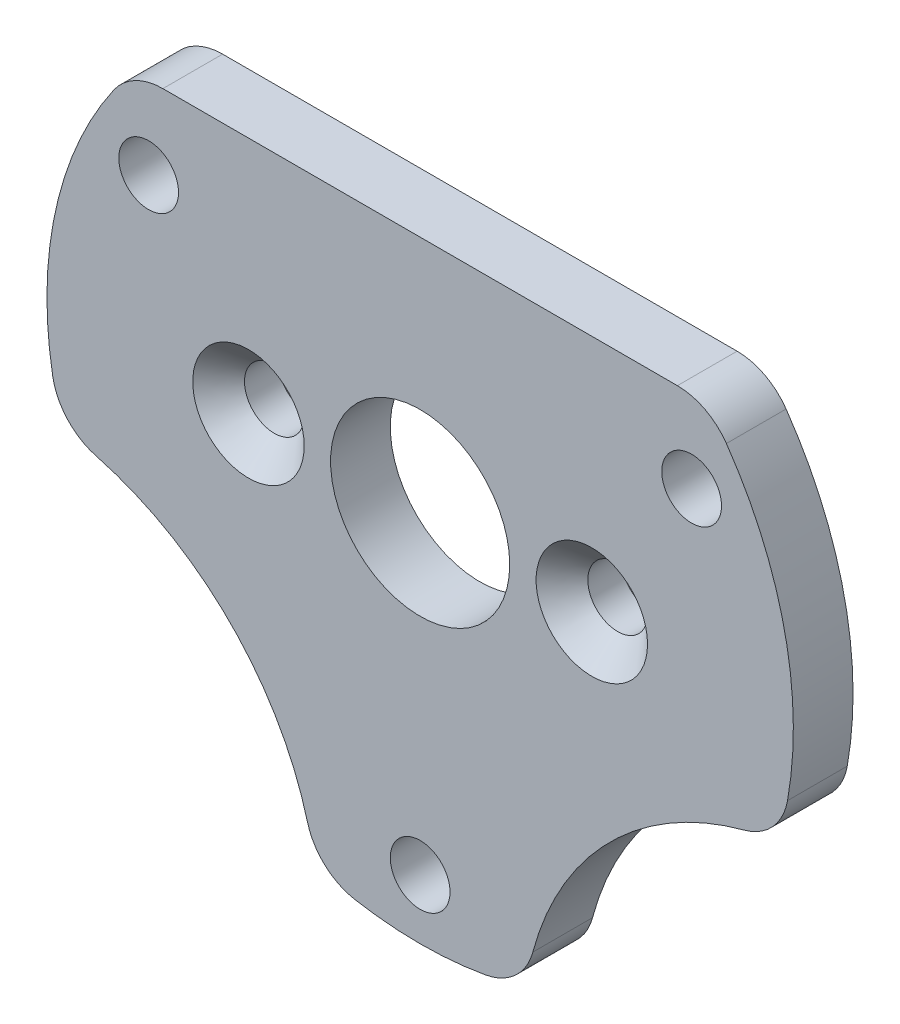
ISO-10303-21;
HEADER;
FILE_DESCRIPTION(('STEP AP214'),'2;1');
FILE_NAME('part.step','',(''),(''),'','','');
FILE_SCHEMA(('AUTOMOTIVE_DESIGN { 1 0 10303 214 1 1 1 1 }'));
ENDSEC;
DATA;
#1=APPLICATION_CONTEXT('core data for automotive mechanical design processes');
#2=APPLICATION_PROTOCOL_DEFINITION('international standard','automotive_design',2000,#1);
#3=PRODUCT_CONTEXT('',#1,'mechanical');
#4=PRODUCT('Part','Part','',(#3));
#5=PRODUCT_RELATED_PRODUCT_CATEGORY('part','',(#4));
#6=PRODUCT_DEFINITION_FORMATION('','',#4);
#7=PRODUCT_DEFINITION_CONTEXT('part definition',#1,'design');
#8=PRODUCT_DEFINITION('design','',#6,#7);
#9=PRODUCT_DEFINITION_SHAPE('','',#8);
#10=(LENGTH_UNIT() NAMED_UNIT(*) SI_UNIT(.MILLI.,.METRE.));
#11=(NAMED_UNIT(*) PLANE_ANGLE_UNIT() SI_UNIT($,.RADIAN.));
#12=(NAMED_UNIT(*) SI_UNIT($,.STERADIAN.) SOLID_ANGLE_UNIT());
#13=UNCERTAINTY_MEASURE_WITH_UNIT(LENGTH_MEASURE(1.E-05),#10,'distance_accuracy_value','');
#14=(GEOMETRIC_REPRESENTATION_CONTEXT(3) GLOBAL_UNCERTAINTY_ASSIGNED_CONTEXT((#13)) GLOBAL_UNIT_ASSIGNED_CONTEXT((#10,
#11,#12)) REPRESENTATION_CONTEXT('',''));
#15=CARTESIAN_POINT('',(0.,0.,0.));
#16=DIRECTION('',(0.,0.,1.));
#17=DIRECTION('',(1.,0.,0.));
#18=AXIS2_PLACEMENT_3D('',#15,#16,#17);
#19=CARTESIAN_POINT('',(0.,0.,2.));
#20=DIRECTION('',(0.,0.,-1.));
#21=DIRECTION('',(-1.,0.,0.));
#22=AXIS2_PLACEMENT_3D('',#19,#20,#21);
#23=CYLINDRICAL_SURFACE('',#22,12.5);
#24=CARTESIAN_POINT('',(0.,0.,0.));
#25=DIRECTION('',(0.,0.,1.));
#26=DIRECTION('',(1.,0.,0.));
#27=AXIS2_PLACEMENT_3D('',#24,#25,#26);
#28=CIRCLE('',#27,12.5);
#29=CARTESIAN_POINT('',(-2.19259090002556,-12.3061994598302,0.));
#30=VERTEX_POINT('',#29);
#31=CARTESIAN_POINT('',(2.19259090002556,-12.3061994598302,0.));
#32=VERTEX_POINT('',#31);
#33=EDGE_CURVE('E259',#30,#32,#28,.T.);
#34=ORIENTED_EDGE('',*,*,#33,.T.);
#35=DIRECTION('',(0.,0.,-1.));
#36=VECTOR('',#35,1.);
#37=CARTESIAN_POINT('',(2.19259090002556,-12.3061994598302,2.));
#38=LINE('',#37,#36);
#39=CARTESIAN_POINT('',(2.19259090002556,-12.3061994598302,2.));
#40=VERTEX_POINT('',#39);
#41=EDGE_CURVE('E183',#32,#40,#38,.F.);
#42=ORIENTED_EDGE('',*,*,#41,.T.);
#43=CARTESIAN_POINT('',(0.,0.,2.));
#44=DIRECTION('',(0.,0.,1.));
#45=DIRECTION('',(1.,0.,0.));
#46=AXIS2_PLACEMENT_3D('',#43,#44,#45);
#47=CIRCLE('',#46,12.5);
#48=CARTESIAN_POINT('',(-2.19259090002556,-12.3061994598302,2.));
#49=VERTEX_POINT('',#48);
#50=EDGE_CURVE('E147',#49,#40,#47,.T.);
#51=ORIENTED_EDGE('',*,*,#50,.F.);
#52=DIRECTION('',(0.,0.,-1.));
#53=VECTOR('',#52,1.);
#54=CARTESIAN_POINT('',(-2.19259090002556,-12.3061994598302,2.));
#55=LINE('',#54,#53);
#56=EDGE_CURVE('E137',#49,#30,#55,.T.);
#57=ORIENTED_EDGE('',*,*,#56,.T.);
#58=EDGE_LOOP('',(#34,#42,#51,#57));
#59=FACE_BOUND('',#58,.T.);
#60=ADVANCED_FACE('F34',(#59),#23,.T.);
#61=CARTESIAN_POINT('',(-10.2581475831036,7.14285714285714,0.));
#62=VERTEX_POINT('',#61);
#63=CARTESIAN_POINT('',(-12.3061994598302,-2.19259090002552,0.));
#64=VERTEX_POINT('',#63);
#65=EDGE_CURVE('E257',#62,#64,#28,.T.);
#66=ORIENTED_EDGE('',*,*,#65,.T.);
#67=DIRECTION('',(0.,0.,-1.));
#68=VECTOR('',#67,1.);
#69=CARTESIAN_POINT('',(-12.3061994598302,-2.19259090002552,2.));
#70=LINE('',#69,#68);
#71=CARTESIAN_POINT('',(-12.3061994598302,-2.19259090002552,2.));
#72=VERTEX_POINT('',#71);
#73=EDGE_CURVE('E192',#64,#72,#70,.F.);
#74=ORIENTED_EDGE('',*,*,#73,.T.);
#75=CARTESIAN_POINT('',(-10.2581475831036,7.14285714285714,2.));
#76=VERTEX_POINT('',#75);
#77=EDGE_CURVE('E150',#76,#72,#47,.T.);
#78=ORIENTED_EDGE('',*,*,#77,.F.);
#79=DIRECTION('',(0.,0.,-1.));
#80=VECTOR('',#79,1.);
#81=CARTESIAN_POINT('',(-10.2581475831036,7.14285714285714,2.));
#82=LINE('',#81,#80);
#83=EDGE_CURVE('E189',#76,#62,#82,.T.);
#84=ORIENTED_EDGE('',*,*,#83,.T.);
#85=EDGE_LOOP('',(#66,#74,#78,#84));
#86=FACE_BOUND('',#85,.T.);
#87=ADVANCED_FACE('F274',(#86),#23,.T.);
#88=CARTESIAN_POINT('',(0.,0.,2.));
#89=DIRECTION('',(0.,0.,1.));
#90=DIRECTION('',(1.,0.,0.));
#91=AXIS2_PLACEMENT_3D('',#88,#89,#90);
#92=PLANE('',#91);
#93=CARTESIAN_POINT('',(5.75,0.,2.));
#94=DIRECTION('',(0.,0.,1.));
#95=DIRECTION('',(1.,0.,0.));
#96=AXIS2_PLACEMENT_3D('',#93,#94,#95);
#97=CIRCLE('',#96,1.86600000000001);
#98=CARTESIAN_POINT('',(7.61600000000001,0.,2.));
#99=VERTEX_POINT('',#98);
#100=EDGE_CURVE('E42',#99,#99,#97,.F.);
#101=ORIENTED_EDGE('',*,*,#100,.T.);
#102=EDGE_LOOP('',(#101));
#103=FACE_BOUND('',#102,.T.);
#104=CARTESIAN_POINT('',(-5.75,0.,2.));
#105=DIRECTION('',(0.,0.,1.));
#106=DIRECTION('',(1.,0.,0.));
#107=AXIS2_PLACEMENT_3D('',#104,#105,#106);
#108=CIRCLE('',#107,1.86600000000001);
#109=CARTESIAN_POINT('',(-3.88399999999999,0.,2.));
#110=VERTEX_POINT('',#109);
#111=EDGE_CURVE('E203',#110,#110,#108,.F.);
#112=ORIENTED_EDGE('',*,*,#111,.T.);
#113=EDGE_LOOP('',(#112));
#114=FACE_BOUND('',#113,.T.);
#115=CARTESIAN_POINT('',(13.4350288425444,-13.4350288425444,2.));
#116=DIRECTION('',(0.,0.,1.));
#117=DIRECTION('',(1.,0.,0.));
#118=AXIS2_PLACEMENT_3D('',#115,#116,#117);
#119=CIRCLE('',#118,10.);
#120=CARTESIAN_POINT('',(10.8535110956386,-3.77398510377526,2.));
#121=VERTEX_POINT('',#120);
#122=CARTESIAN_POINT('',(3.7739851037753,-10.8535110956385,2.));
#123=VERTEX_POINT('',#122);
#124=EDGE_CURVE('E133',#121,#123,#119,.T.);
#125=ORIENTED_EDGE('',*,*,#124,.F.);
#126=CARTESIAN_POINT('',(10.3372075462574,-1.84177635602143,2.));
#127=DIRECTION('',(0.,0.,1.));
#128=DIRECTION('',(1.,0.,0.));
#129=AXIS2_PLACEMENT_3D('',#126,#127,#128);
#130=CIRCLE('',#129,2.);
#131=CARTESIAN_POINT('',(12.3061994598302,-2.19259090002551,2.));
#132=VERTEX_POINT('',#131);
#133=EDGE_CURVE('E126',#121,#132,#130,.T.);
#134=ORIENTED_EDGE('',*,*,#133,.T.);
#135=CARTESIAN_POINT('',(10.2581475831036,7.14285714285714,2.));
#136=VERTEX_POINT('',#135);
#137=EDGE_CURVE('E130',#132,#136,#47,.T.);
#138=ORIENTED_EDGE('',*,*,#137,.T.);
#139=CARTESIAN_POINT('',(8.61684396980704,6.,2.));
#140=DIRECTION('',(0.,0.,1.));
#141=DIRECTION('',(1.,0.,0.));
#142=AXIS2_PLACEMENT_3D('',#139,#140,#141);
#143=CIRCLE('',#142,2.);
#144=CARTESIAN_POINT('',(8.61684396980704,8.,2.));
#145=VERTEX_POINT('',#144);
#146=EDGE_CURVE('E175',#136,#145,#143,.T.);
#147=ORIENTED_EDGE('',*,*,#146,.T.);
#148=DIRECTION('',(-1.,0.,0.));
#149=VECTOR('',#148,1.);
#150=CARTESIAN_POINT('',(-9.60468635614927,8.,2.));
#151=LINE('',#150,#149);
#152=CARTESIAN_POINT('',(-8.61684396980704,8.,2.));
#153=VERTEX_POINT('',#152);
#154=EDGE_CURVE('E157',#145,#153,#151,.T.);
#155=ORIENTED_EDGE('',*,*,#154,.T.);
#156=CARTESIAN_POINT('',(-8.61684396980704,6.,2.));
#157=DIRECTION('',(0.,0.,1.));
#158=DIRECTION('',(1.,0.,0.));
#159=AXIS2_PLACEMENT_3D('',#156,#157,#158);
#160=CIRCLE('',#159,2.);
#161=EDGE_CURVE('E173',#153,#76,#160,.T.);
#162=ORIENTED_EDGE('',*,*,#161,.T.);
#163=ORIENTED_EDGE('',*,*,#77,.T.);
#164=CARTESIAN_POINT('',(-10.3372075462574,-1.84177635602144,2.));
#165=DIRECTION('',(0.,0.,1.));
#166=DIRECTION('',(1.,0.,0.));
#167=AXIS2_PLACEMENT_3D('',#164,#165,#166);
#168=CIRCLE('',#167,2.);
#169=CARTESIAN_POINT('',(-10.8535110956385,-3.77398510377526,2.));
#170=VERTEX_POINT('',#169);
#171=EDGE_CURVE('E177',#72,#170,#168,.T.);
#172=ORIENTED_EDGE('',*,*,#171,.T.);
#173=CARTESIAN_POINT('',(-13.4350288425444,-13.4350288425444,2.));
#174=DIRECTION('',(0.,0.,1.));
#175=DIRECTION('',(-1.,0.,0.));
#176=AXIS2_PLACEMENT_3D('',#173,#174,#175);
#177=CIRCLE('',#176,10.);
#178=CARTESIAN_POINT('',(-3.7739851037753,-10.8535110956385,2.));
#179=VERTEX_POINT('',#178);
#180=EDGE_CURVE('E282',#179,#170,#177,.T.);
#181=ORIENTED_EDGE('',*,*,#180,.F.);
#182=CARTESIAN_POINT('',(-1.84177635602147,-10.3372075462574,2.));
#183=DIRECTION('',(0.,0.,1.));
#184=DIRECTION('',(1.,0.,0.));
#185=AXIS2_PLACEMENT_3D('',#182,#183,#184);
#186=CIRCLE('',#185,2.);
#187=EDGE_CURVE('E57',#179,#49,#186,.T.);
#188=ORIENTED_EDGE('',*,*,#187,.T.);
#189=ORIENTED_EDGE('',*,*,#50,.T.);
#190=CARTESIAN_POINT('',(1.84177635602147,-10.3372075462574,2.));
#191=DIRECTION('',(0.,0.,1.));
#192=DIRECTION('',(1.,0.,0.));
#193=AXIS2_PLACEMENT_3D('',#190,#191,#192);
#194=CIRCLE('',#193,2.);
#195=EDGE_CURVE('E49',#40,#123,#194,.T.);
#196=ORIENTED_EDGE('',*,*,#195,.T.);
#197=EDGE_LOOP('',(#125,#134,#138,#147,#155,#162,#163,#172,#181,#188,#189,#196));
#198=FACE_BOUND('',#197,.T.);
#199=CARTESIAN_POINT('',(9.0932667397366,5.25,2.));
#200=DIRECTION('',(0.,0.,1.));
#201=DIRECTION('',(1.,0.,0.));
#202=AXIS2_PLACEMENT_3D('',#199,#200,#201);
#203=CIRCLE('',#202,1.);
#204=CARTESIAN_POINT('',(10.0932667397366,5.25,2.));
#205=VERTEX_POINT('',#204);
#206=EDGE_CURVE('E237',#205,#205,#203,.T.);
#207=ORIENTED_EDGE('',*,*,#206,.F.);
#208=EDGE_LOOP('',(#207));
#209=FACE_BOUND('',#208,.T.);
#210=CARTESIAN_POINT('',(0.,-10.5,2.));
#211=DIRECTION('',(0.,0.,1.));
#212=DIRECTION('',(1.,0.,0.));
#213=AXIS2_PLACEMENT_3D('',#210,#211,#212);
#214=CIRCLE('',#213,1.);
#215=CARTESIAN_POINT('',(0.999999999999999,-10.5,2.));
#216=VERTEX_POINT('',#215);
#217=EDGE_CURVE('E249',#216,#216,#214,.T.);
#218=ORIENTED_EDGE('',*,*,#217,.F.);
#219=EDGE_LOOP('',(#218));
#220=FACE_BOUND('',#219,.T.);
#221=CARTESIAN_POINT('',(-9.09326673973661,5.25,2.));
#222=DIRECTION('',(0.,0.,1.));
#223=DIRECTION('',(1.,0.,0.));
#224=AXIS2_PLACEMENT_3D('',#221,#222,#223);
#225=CIRCLE('',#224,1.);
#226=CARTESIAN_POINT('',(-8.09326673973661,5.25,2.));
#227=VERTEX_POINT('',#226);
#228=EDGE_CURVE('E243',#227,#227,#225,.T.);
#229=ORIENTED_EDGE('',*,*,#228,.F.);
#230=EDGE_LOOP('',(#229));
#231=FACE_BOUND('',#230,.T.);
#232=CARTESIAN_POINT('',(0.,0.,2.));
#233=DIRECTION('',(0.,0.,1.));
#234=DIRECTION('',(1.,0.,0.));
#235=AXIS2_PLACEMENT_3D('',#232,#233,#234);
#236=CIRCLE('',#235,3.);
#237=CARTESIAN_POINT('',(3.,0.,2.));
#238=VERTEX_POINT('',#237);
#239=EDGE_CURVE('E227',#238,#238,#236,.T.);
#240=ORIENTED_EDGE('',*,*,#239,.F.);
#241=EDGE_LOOP('',(#240));
#242=FACE_BOUND('',#241,.T.);
#243=ADVANCED_FACE('F128',(#103,#114,#198,#209,#220,#231,#242),#92,.T.);
#244=CARTESIAN_POINT('',(0.,0.,0.));
#245=DIRECTION('',(0.,0.,1.));
#246=DIRECTION('',(1.,0.,0.));
#247=AXIS2_PLACEMENT_3D('',#244,#245,#246);
#248=PLANE('',#247);
#249=CARTESIAN_POINT('',(12.3061994598302,-2.19259090002551,0.));
#250=VERTEX_POINT('',#249);
#251=CARTESIAN_POINT('',(10.2581475831036,7.14285714285714,0.));
#252=VERTEX_POINT('',#251);
#253=EDGE_CURVE('E252',#250,#252,#28,.T.);
#254=ORIENTED_EDGE('',*,*,#253,.F.);
#255=CARTESIAN_POINT('',(10.3372075462574,-1.84177635602143,0.));
#256=DIRECTION('',(0.,0.,1.));
#257=DIRECTION('',(1.,0.,0.));
#258=AXIS2_PLACEMENT_3D('',#255,#256,#257);
#259=CIRCLE('',#258,2.);
#260=CARTESIAN_POINT('',(10.8535110956386,-3.77398510377526,0.));
#261=VERTEX_POINT('',#260);
#262=EDGE_CURVE('E152',#250,#261,#259,.F.);
#263=ORIENTED_EDGE('',*,*,#262,.T.);
#264=CARTESIAN_POINT('',(13.4350288425444,-13.4350288425444,0.));
#265=DIRECTION('',(0.,0.,1.));
#266=DIRECTION('',(1.,0.,0.));
#267=AXIS2_PLACEMENT_3D('',#264,#265,#266);
#268=CIRCLE('',#267,10.);
#269=CARTESIAN_POINT('',(3.7739851037753,-10.8535110956385,0.));
#270=VERTEX_POINT('',#269);
#271=EDGE_CURVE('E289',#261,#270,#268,.T.);
#272=ORIENTED_EDGE('',*,*,#271,.T.);
#273=CARTESIAN_POINT('',(1.84177635602147,-10.3372075462574,0.));
#274=DIRECTION('',(0.,0.,1.));
#275=DIRECTION('',(1.,0.,0.));
#276=AXIS2_PLACEMENT_3D('',#273,#274,#275);
#277=CIRCLE('',#276,2.);
#278=EDGE_CURVE('E166',#270,#32,#277,.F.);
#279=ORIENTED_EDGE('',*,*,#278,.T.);
#280=ORIENTED_EDGE('',*,*,#33,.F.);
#281=CARTESIAN_POINT('',(-1.84177635602147,-10.3372075462574,0.));
#282=DIRECTION('',(0.,0.,1.));
#283=DIRECTION('',(1.,0.,0.));
#284=AXIS2_PLACEMENT_3D('',#281,#282,#283);
#285=CIRCLE('',#284,2.);
#286=CARTESIAN_POINT('',(-3.7739851037753,-10.8535110956385,0.));
#287=VERTEX_POINT('',#286);
#288=EDGE_CURVE('E164',#30,#287,#285,.F.);
#289=ORIENTED_EDGE('',*,*,#288,.T.);
#290=CARTESIAN_POINT('',(-13.4350288425444,-13.4350288425444,0.));
#291=DIRECTION('',(0.,0.,1.));
#292=DIRECTION('',(1.,0.,0.));
#293=AXIS2_PLACEMENT_3D('',#290,#291,#292);
#294=CIRCLE('',#293,10.);
#295=CARTESIAN_POINT('',(-10.8535110956385,-3.77398510377526,0.));
#296=VERTEX_POINT('',#295);
#297=EDGE_CURVE('E288',#287,#296,#294,.T.);
#298=ORIENTED_EDGE('',*,*,#297,.T.);
#299=CARTESIAN_POINT('',(-10.3372075462574,-1.84177635602144,0.));
#300=DIRECTION('',(0.,0.,1.));
#301=DIRECTION('',(1.,0.,0.));
#302=AXIS2_PLACEMENT_3D('',#299,#300,#301);
#303=CIRCLE('',#302,2.);
#304=EDGE_CURVE('E162',#296,#64,#303,.F.);
#305=ORIENTED_EDGE('',*,*,#304,.T.);
#306=ORIENTED_EDGE('',*,*,#65,.F.);
#307=CARTESIAN_POINT('',(-8.61684396980704,6.,0.));
#308=DIRECTION('',(0.,0.,1.));
#309=DIRECTION('',(1.,0.,0.));
#310=AXIS2_PLACEMENT_3D('',#307,#308,#309);
#311=CIRCLE('',#310,2.);
#312=CARTESIAN_POINT('',(-8.61684396980704,8.,0.));
#313=VERTEX_POINT('',#312);
#314=EDGE_CURVE('E153',#62,#313,#311,.F.);
#315=ORIENTED_EDGE('',*,*,#314,.T.);
#316=DIRECTION('',(-1.,0.,0.));
#317=VECTOR('',#316,1.);
#318=CARTESIAN_POINT('',(-9.60468635614927,8.,0.));
#319=LINE('',#318,#317);
#320=CARTESIAN_POINT('',(8.61684396980704,8.,0.));
#321=VERTEX_POINT('',#320);
#322=EDGE_CURVE('E148',#321,#313,#319,.T.);
#323=ORIENTED_EDGE('',*,*,#322,.F.);
#324=CARTESIAN_POINT('',(8.61684396980704,6.,0.));
#325=DIRECTION('',(0.,0.,1.));
#326=DIRECTION('',(1.,0.,0.));
#327=AXIS2_PLACEMENT_3D('',#324,#325,#326);
#328=CIRCLE('',#327,2.);
#329=EDGE_CURVE('E155',#321,#252,#328,.F.);
#330=ORIENTED_EDGE('',*,*,#329,.T.);
#331=EDGE_LOOP('',(#254,#263,#272,#279,#280,#289,#298,#305,#306,#315,#323,#330));
#332=FACE_BOUND('',#331,.T.);
#333=CARTESIAN_POINT('',(0.,-10.5,0.));
#334=DIRECTION('',(0.,0.,1.));
#335=DIRECTION('',(1.,0.,0.));
#336=AXIS2_PLACEMENT_3D('',#333,#334,#335);
#337=CIRCLE('',#336,1.);
#338=CARTESIAN_POINT('',(0.999999999999999,-10.5,0.));
#339=VERTEX_POINT('',#338);
#340=EDGE_CURVE('E246',#339,#339,#337,.T.);
#341=ORIENTED_EDGE('',*,*,#340,.T.);
#342=EDGE_LOOP('',(#341));
#343=FACE_BOUND('',#342,.T.);
#344=CARTESIAN_POINT('',(-9.09326673973661,5.25,0.));
#345=DIRECTION('',(0.,0.,1.));
#346=DIRECTION('',(1.,0.,0.));
#347=AXIS2_PLACEMENT_3D('',#344,#345,#346);
#348=CIRCLE('',#347,1.);
#349=CARTESIAN_POINT('',(-8.09326673973661,5.25,0.));
#350=VERTEX_POINT('',#349);
#351=EDGE_CURVE('E240',#350,#350,#348,.T.);
#352=ORIENTED_EDGE('',*,*,#351,.T.);
#353=EDGE_LOOP('',(#352));
#354=FACE_BOUND('',#353,.T.);
#355=CARTESIAN_POINT('',(9.0932667397366,5.25,0.));
#356=DIRECTION('',(0.,0.,1.));
#357=DIRECTION('',(1.,0.,0.));
#358=AXIS2_PLACEMENT_3D('',#355,#356,#357);
#359=CIRCLE('',#358,1.);
#360=CARTESIAN_POINT('',(10.0932667397366,5.25,0.));
#361=VERTEX_POINT('',#360);
#362=EDGE_CURVE('E230',#361,#361,#359,.T.);
#363=ORIENTED_EDGE('',*,*,#362,.T.);
#364=EDGE_LOOP('',(#363));
#365=FACE_BOUND('',#364,.T.);
#366=CARTESIAN_POINT('',(-5.75,0.,0.));
#367=DIRECTION('',(0.,0.,1.));
#368=DIRECTION('',(1.,0.,0.));
#369=AXIS2_PLACEMENT_3D('',#366,#367,#368);
#370=CIRCLE('',#369,1.);
#371=CARTESIAN_POINT('',(-4.75,0.,0.));
#372=VERTEX_POINT('',#371);
#373=EDGE_CURVE('E226',#372,#372,#370,.T.);
#374=ORIENTED_EDGE('',*,*,#373,.T.);
#375=EDGE_LOOP('',(#374));
#376=FACE_BOUND('',#375,.T.);
#377=CARTESIAN_POINT('',(5.75,0.,0.));
#378=DIRECTION('',(0.,0.,1.));
#379=DIRECTION('',(-1.,0.,0.));
#380=AXIS2_PLACEMENT_3D('',#377,#378,#379);
#381=CIRCLE('',#380,1.);
#382=CARTESIAN_POINT('',(4.75,0.,0.));
#383=VERTEX_POINT('',#382);
#384=EDGE_CURVE('E224',#383,#383,#381,.T.);
#385=ORIENTED_EDGE('',*,*,#384,.T.);
#386=EDGE_LOOP('',(#385));
#387=FACE_BOUND('',#386,.T.);
#388=CARTESIAN_POINT('',(0.,0.,0.));
#389=DIRECTION('',(0.,0.,1.));
#390=DIRECTION('',(1.,0.,0.));
#391=AXIS2_PLACEMENT_3D('',#388,#389,#390);
#392=CIRCLE('',#391,3.);
#393=CARTESIAN_POINT('',(3.,0.,0.));
#394=VERTEX_POINT('',#393);
#395=EDGE_CURVE('E233',#394,#394,#392,.T.);
#396=ORIENTED_EDGE('',*,*,#395,.T.);
#397=EDGE_LOOP('',(#396));
#398=FACE_BOUND('',#397,.T.);
#399=ADVANCED_FACE('F302',(#332,#343,#354,#365,#376,#387,#398),#248,.F.);
#400=ORIENTED_EDGE('',*,*,#137,.F.);
#401=DIRECTION('',(0.,0.,-1.));
#402=VECTOR('',#401,1.);
#403=CARTESIAN_POINT('',(12.3061994598302,-2.19259090002551,2.));
#404=LINE('',#403,#402);
#405=EDGE_CURVE('E143',#132,#250,#404,.T.);
#406=ORIENTED_EDGE('',*,*,#405,.T.);
#407=ORIENTED_EDGE('',*,*,#253,.T.);
#408=DIRECTION('',(0.,0.,-1.));
#409=VECTOR('',#408,1.);
#410=CARTESIAN_POINT('',(10.2581475831036,7.14285714285714,2.));
#411=LINE('',#410,#409);
#412=EDGE_CURVE('E146',#252,#136,#411,.F.);
#413=ORIENTED_EDGE('',*,*,#412,.T.);
#414=EDGE_LOOP('',(#400,#406,#407,#413));
#415=FACE_BOUND('',#414,.T.);
#416=ADVANCED_FACE('F141',(#415),#23,.T.);
#417=CARTESIAN_POINT('',(-9.60468635614927,8.,2.));
#418=DIRECTION('',(0.,-1.,0.));
#419=DIRECTION('',(0.,0.,-1.));
#420=AXIS2_PLACEMENT_3D('',#417,#418,#419);
#421=PLANE('',#420);
#422=ORIENTED_EDGE('',*,*,#154,.F.);
#423=DIRECTION('',(0.,0.,-1.));
#424=VECTOR('',#423,1.);
#425=CARTESIAN_POINT('',(8.61684396980704,8.,2.));
#426=LINE('',#425,#424);
#427=EDGE_CURVE('E197',#145,#321,#426,.T.);
#428=ORIENTED_EDGE('',*,*,#427,.T.);
#429=ORIENTED_EDGE('',*,*,#322,.T.);
#430=DIRECTION('',(0.,0.,-1.));
#431=VECTOR('',#430,1.);
#432=CARTESIAN_POINT('',(-8.61684396980704,8.,2.));
#433=LINE('',#432,#431);
#434=EDGE_CURVE('E195',#313,#153,#433,.F.);
#435=ORIENTED_EDGE('',*,*,#434,.T.);
#436=EDGE_LOOP('',(#422,#428,#429,#435));
#437=FACE_BOUND('',#436,.T.);
#438=ADVANCED_FACE('F265',(#437),#421,.F.);
#439=CARTESIAN_POINT('',(0.,-10.5,2.));
#440=DIRECTION('',(0.,0.,-1.));
#441=DIRECTION('',(-1.,0.,0.));
#442=AXIS2_PLACEMENT_3D('',#439,#440,#441);
#443=CYLINDRICAL_SURFACE('',#442,1.);
#444=ORIENTED_EDGE('',*,*,#217,.T.);
#445=EDGE_LOOP('',(#444));
#446=FACE_BOUND('',#445,.T.);
#447=ORIENTED_EDGE('',*,*,#340,.F.);
#448=EDGE_LOOP('',(#447));
#449=FACE_BOUND('',#448,.T.);
#450=ADVANCED_FACE('F329',(#446,#449),#443,.F.);
#451=CARTESIAN_POINT('',(-9.09326673973661,5.25,2.));
#452=DIRECTION('',(0.,0.,-1.));
#453=DIRECTION('',(-1.,0.,0.));
#454=AXIS2_PLACEMENT_3D('',#451,#452,#453);
#455=CYLINDRICAL_SURFACE('',#454,1.);
#456=ORIENTED_EDGE('',*,*,#228,.T.);
#457=EDGE_LOOP('',(#456));
#458=FACE_BOUND('',#457,.T.);
#459=ORIENTED_EDGE('',*,*,#351,.F.);
#460=EDGE_LOOP('',(#459));
#461=FACE_BOUND('',#460,.T.);
#462=ADVANCED_FACE('F338',(#458,#461),#455,.F.);
#463=CARTESIAN_POINT('',(9.0932667397366,5.25,2.));
#464=DIRECTION('',(0.,0.,-1.));
#465=DIRECTION('',(-1.,0.,0.));
#466=AXIS2_PLACEMENT_3D('',#463,#464,#465);
#467=CYLINDRICAL_SURFACE('',#466,1.);
#468=ORIENTED_EDGE('',*,*,#206,.T.);
#469=EDGE_LOOP('',(#468));
#470=FACE_BOUND('',#469,.T.);
#471=ORIENTED_EDGE('',*,*,#362,.F.);
#472=EDGE_LOOP('',(#471));
#473=FACE_BOUND('',#472,.T.);
#474=ADVANCED_FACE('F342',(#470,#473),#467,.F.);
#475=CARTESIAN_POINT('',(-5.75,0.,2.));
#476=DIRECTION('',(0.,0.,-1.));
#477=DIRECTION('',(-1.,0.,0.));
#478=AXIS2_PLACEMENT_3D('',#475,#476,#477);
#479=CYLINDRICAL_SURFACE('',#478,1.);
#480=CARTESIAN_POINT('',(-5.75,0.,1.134));
#481=DIRECTION('',(0.,0.,1.));
#482=DIRECTION('',(1.,0.,0.));
#483=AXIS2_PLACEMENT_3D('',#480,#481,#482);
#484=CIRCLE('',#483,1.);
#485=CARTESIAN_POINT('',(-4.75,0.,1.134));
#486=VERTEX_POINT('',#485);
#487=EDGE_CURVE('E11',#486,#486,#484,.T.);
#488=ORIENTED_EDGE('',*,*,#487,.T.);
#489=EDGE_LOOP('',(#488));
#490=FACE_BOUND('',#489,.T.);
#491=ORIENTED_EDGE('',*,*,#373,.F.);
#492=EDGE_LOOP('',(#491));
#493=FACE_BOUND('',#492,.T.);
#494=ADVANCED_FACE('F220',(#490,#493),#479,.F.);
#495=CARTESIAN_POINT('',(5.75,0.,2.));
#496=DIRECTION('',(0.,0.,-1.));
#497=DIRECTION('',(-1.,0.,0.));
#498=AXIS2_PLACEMENT_3D('',#495,#496,#497);
#499=CYLINDRICAL_SURFACE('',#498,1.);
#500=CARTESIAN_POINT('',(5.75,0.,1.134));
#501=DIRECTION('',(0.,0.,1.));
#502=DIRECTION('',(1.,0.,0.));
#503=AXIS2_PLACEMENT_3D('',#500,#501,#502);
#504=CIRCLE('',#503,1.);
#505=CARTESIAN_POINT('',(6.75,0.,1.134));
#506=VERTEX_POINT('',#505);
#507=EDGE_CURVE('E200',#506,#506,#504,.T.);
#508=ORIENTED_EDGE('',*,*,#507,.T.);
#509=EDGE_LOOP('',(#508));
#510=FACE_BOUND('',#509,.T.);
#511=ORIENTED_EDGE('',*,*,#384,.F.);
#512=EDGE_LOOP('',(#511));
#513=FACE_BOUND('',#512,.T.);
#514=ADVANCED_FACE('F216',(#510,#513),#499,.F.);
#515=CARTESIAN_POINT('',(0.,0.,2.));
#516=DIRECTION('',(0.,0.,-1.));
#517=DIRECTION('',(-1.,0.,0.));
#518=AXIS2_PLACEMENT_3D('',#515,#516,#517);
#519=CYLINDRICAL_SURFACE('',#518,3.);
#520=ORIENTED_EDGE('',*,*,#239,.T.);
#521=EDGE_LOOP('',(#520));
#522=FACE_BOUND('',#521,.T.);
#523=ORIENTED_EDGE('',*,*,#395,.F.);
#524=EDGE_LOOP('',(#523));
#525=FACE_BOUND('',#524,.T.);
#526=ADVANCED_FACE('F219',(#522,#525),#519,.F.);
#527=CARTESIAN_POINT('',(-13.4350288425444,-13.4350288425444,-8.));
#528=DIRECTION('',(0.,0.,1.));
#529=DIRECTION('',(1.,0.,0.));
#530=AXIS2_PLACEMENT_3D('',#527,#528,#529);
#531=CYLINDRICAL_SURFACE('',#530,10.);
#532=ORIENTED_EDGE('',*,*,#297,.F.);
#533=DIRECTION('',(0.,0.,1.));
#534=VECTOR('',#533,1.);
#535=CARTESIAN_POINT('',(-3.77398510377529,-10.8535110956385,-8.));
#536=LINE('',#535,#534);
#537=EDGE_CURVE('E187',#287,#179,#536,.T.);
#538=ORIENTED_EDGE('',*,*,#537,.T.);
#539=ORIENTED_EDGE('',*,*,#180,.T.);
#540=DIRECTION('',(0.,0.,1.));
#541=VECTOR('',#540,1.);
#542=CARTESIAN_POINT('',(-10.8535110956385,-3.77398510377526,-8.));
#543=LINE('',#542,#541);
#544=EDGE_CURVE('E185',#170,#296,#543,.F.);
#545=ORIENTED_EDGE('',*,*,#544,.T.);
#546=EDGE_LOOP('',(#532,#538,#539,#545));
#547=FACE_BOUND('',#546,.T.);
#548=ADVANCED_FACE('F285',(#547),#531,.F.);
#549=CARTESIAN_POINT('',(13.4350288425444,-13.4350288425444,-8.));
#550=DIRECTION('',(0.,0.,1.));
#551=DIRECTION('',(1.,0.,0.));
#552=AXIS2_PLACEMENT_3D('',#549,#550,#551);
#553=CYLINDRICAL_SURFACE('',#552,10.);
#554=ORIENTED_EDGE('',*,*,#271,.F.);
#555=DIRECTION('',(0.,0.,1.));
#556=VECTOR('',#555,1.);
#557=CARTESIAN_POINT('',(10.8535110956386,-3.77398510377525,-8.));
#558=LINE('',#557,#556);
#559=EDGE_CURVE('E171',#261,#121,#558,.T.);
#560=ORIENTED_EDGE('',*,*,#559,.T.);
#561=ORIENTED_EDGE('',*,*,#124,.T.);
#562=DIRECTION('',(0.,0.,1.));
#563=VECTOR('',#562,1.);
#564=CARTESIAN_POINT('',(3.7739851037753,-10.8535110956385,-8.));
#565=LINE('',#564,#563);
#566=EDGE_CURVE('E169',#123,#270,#565,.F.);
#567=ORIENTED_EDGE('',*,*,#566,.T.);
#568=EDGE_LOOP('',(#554,#560,#561,#567));
#569=FACE_BOUND('',#568,.T.);
#570=ADVANCED_FACE('F297',(#569),#553,.F.);
#571=CARTESIAN_POINT('',(10.3372075462574,-1.84177635602143,-8.));
#572=DIRECTION('',(0.,0.,1.));
#573=DIRECTION('',(1.,0.,0.));
#574=AXIS2_PLACEMENT_3D('',#571,#572,#573);
#575=CYLINDRICAL_SURFACE('',#574,2.);
#576=ORIENTED_EDGE('',*,*,#133,.F.);
#577=ORIENTED_EDGE('',*,*,#559,.F.);
#578=ORIENTED_EDGE('',*,*,#262,.F.);
#579=ORIENTED_EDGE('',*,*,#405,.F.);
#580=EDGE_LOOP('',(#576,#577,#578,#579));
#581=FACE_BOUND('',#580,.T.);
#582=ADVANCED_FACE('F151',(#581),#575,.T.);
#583=CARTESIAN_POINT('',(1.84177635602147,-10.3372075462574,-8.));
#584=DIRECTION('',(0.,0.,-1.));
#585=DIRECTION('',(-1.,0.,0.));
#586=AXIS2_PLACEMENT_3D('',#583,#584,#585);
#587=CYLINDRICAL_SURFACE('',#586,2.);
#588=ORIENTED_EDGE('',*,*,#278,.F.);
#589=ORIENTED_EDGE('',*,*,#566,.F.);
#590=ORIENTED_EDGE('',*,*,#195,.F.);
#591=ORIENTED_EDGE('',*,*,#41,.F.);
#592=EDGE_LOOP('',(#588,#589,#590,#591));
#593=FACE_BOUND('',#592,.T.);
#594=ADVANCED_FACE('F299',(#593),#587,.T.);
#595=CARTESIAN_POINT('',(-1.84177635602147,-10.3372075462574,-8.));
#596=DIRECTION('',(0.,0.,1.));
#597=DIRECTION('',(1.,0.,0.));
#598=AXIS2_PLACEMENT_3D('',#595,#596,#597);
#599=CYLINDRICAL_SURFACE('',#598,2.);
#600=ORIENTED_EDGE('',*,*,#187,.F.);
#601=ORIENTED_EDGE('',*,*,#537,.F.);
#602=ORIENTED_EDGE('',*,*,#288,.F.);
#603=ORIENTED_EDGE('',*,*,#56,.F.);
#604=EDGE_LOOP('',(#600,#601,#602,#603));
#605=FACE_BOUND('',#604,.T.);
#606=ADVANCED_FACE('F315',(#605),#599,.T.);
#607=CARTESIAN_POINT('',(-10.3372075462574,-1.84177635602144,-8.));
#608=DIRECTION('',(0.,0.,-1.));
#609=DIRECTION('',(-1.,0.,0.));
#610=AXIS2_PLACEMENT_3D('',#607,#608,#609);
#611=CYLINDRICAL_SURFACE('',#610,2.);
#612=ORIENTED_EDGE('',*,*,#304,.F.);
#613=ORIENTED_EDGE('',*,*,#544,.F.);
#614=ORIENTED_EDGE('',*,*,#171,.F.);
#615=ORIENTED_EDGE('',*,*,#73,.F.);
#616=EDGE_LOOP('',(#612,#613,#614,#615));
#617=FACE_BOUND('',#616,.T.);
#618=ADVANCED_FACE('F279',(#617),#611,.T.);
#619=CARTESIAN_POINT('',(8.61684396980704,6.,2.));
#620=DIRECTION('',(0.,0.,-1.));
#621=DIRECTION('',(-1.,0.,0.));
#622=AXIS2_PLACEMENT_3D('',#619,#620,#621);
#623=CYLINDRICAL_SURFACE('',#622,2.);
#624=ORIENTED_EDGE('',*,*,#146,.F.);
#625=ORIENTED_EDGE('',*,*,#412,.F.);
#626=ORIENTED_EDGE('',*,*,#329,.F.);
#627=ORIENTED_EDGE('',*,*,#427,.F.);
#628=EDGE_LOOP('',(#624,#625,#626,#627));
#629=FACE_BOUND('',#628,.T.);
#630=ADVANCED_FACE('F307',(#629),#623,.T.);
#631=CARTESIAN_POINT('',(-8.61684396980704,6.,2.));
#632=DIRECTION('',(0.,0.,-1.));
#633=DIRECTION('',(-1.,0.,0.));
#634=AXIS2_PLACEMENT_3D('',#631,#632,#633);
#635=CYLINDRICAL_SURFACE('',#634,2.);
#636=ORIENTED_EDGE('',*,*,#161,.F.);
#637=ORIENTED_EDGE('',*,*,#434,.F.);
#638=ORIENTED_EDGE('',*,*,#314,.F.);
#639=ORIENTED_EDGE('',*,*,#83,.F.);
#640=EDGE_LOOP('',(#636,#637,#638,#639));
#641=FACE_BOUND('',#640,.T.);
#642=ADVANCED_FACE('F213',(#641),#635,.T.);
#643=CARTESIAN_POINT('',(5.75,0.,1.134));
#644=DIRECTION('',(0.,0.,1.));
#645=DIRECTION('',(1.,0.,0.));
#646=AXIS2_PLACEMENT_3D('',#643,#644,#645);
#647=CONICAL_SURFACE('',#646,1.,0.785398163397452);
#648=ORIENTED_EDGE('',*,*,#100,.F.);
#649=EDGE_LOOP('',(#648));
#650=FACE_BOUND('',#649,.T.);
#651=ORIENTED_EDGE('',*,*,#507,.F.);
#652=EDGE_LOOP('',(#651));
#653=FACE_BOUND('',#652,.T.);
#654=ADVANCED_FACE('F210',(#650,#653),#647,.F.);
#655=CARTESIAN_POINT('',(-5.75,0.,1.134));
#656=DIRECTION('',(0.,0.,1.));
#657=DIRECTION('',(1.,0.,0.));
#658=AXIS2_PLACEMENT_3D('',#655,#656,#657);
#659=CONICAL_SURFACE('',#658,1.,0.785398163397452);
#660=ORIENTED_EDGE('',*,*,#111,.F.);
#661=EDGE_LOOP('',(#660));
#662=FACE_BOUND('',#661,.T.);
#663=ORIENTED_EDGE('',*,*,#487,.F.);
#664=EDGE_LOOP('',(#663));
#665=FACE_BOUND('',#664,.T.);
#666=ADVANCED_FACE('F36',(#662,#665),#659,.F.);
#667=CLOSED_SHELL('',(#60,#87,#243,#399,#416,#438,#450,#462,#474,#494,#514,#526,#548,#570,#582,
#594,#606,#618,#630,#642,#654,#666));
#668=MANIFOLD_SOLID_BREP('B2',#667);
#669=ADVANCED_BREP_SHAPE_REPRESENTATION('',(#18,#668),#14);
#670=SHAPE_DEFINITION_REPRESENTATION(#9,#669);
ENDSEC;
END-ISO-10303-21;
